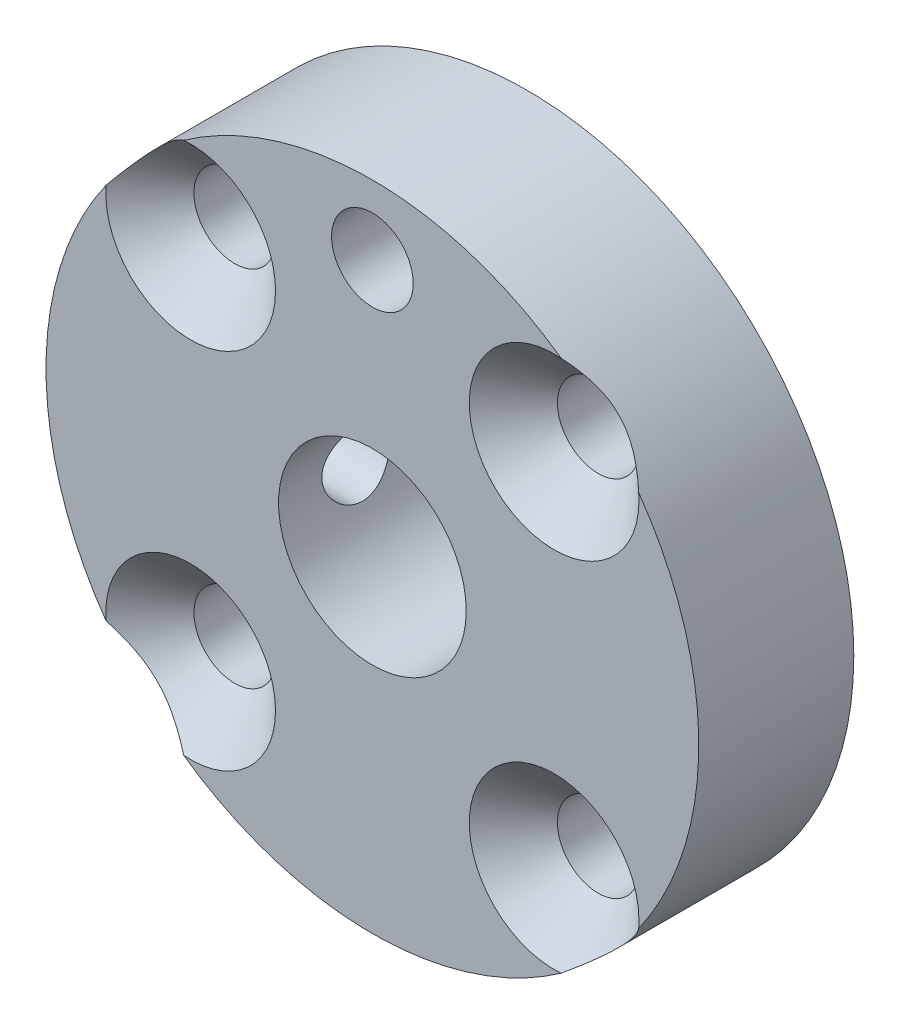
ISO-10303-21;
HEADER;
FILE_DESCRIPTION(('STEP AP214'),'2;1');
FILE_NAME('part.step','',(''),(''),'','','');
FILE_SCHEMA(('AUTOMOTIVE_DESIGN { 1 0 10303 214 1 1 1 1 }'));
ENDSEC;
DATA;
#1=APPLICATION_CONTEXT('core data for automotive mechanical design processes');
#2=APPLICATION_PROTOCOL_DEFINITION('international standard','automotive_design',2000,#1);
#3=PRODUCT_CONTEXT('',#1,'mechanical');
#4=PRODUCT('Part','Part','',(#3));
#5=PRODUCT_RELATED_PRODUCT_CATEGORY('part','',(#4));
#6=PRODUCT_DEFINITION_FORMATION('','',#4);
#7=PRODUCT_DEFINITION_CONTEXT('part definition',#1,'design');
#8=PRODUCT_DEFINITION('design','',#6,#7);
#9=PRODUCT_DEFINITION_SHAPE('','',#8);
#10=(LENGTH_UNIT() NAMED_UNIT(*) SI_UNIT(.MILLI.,.METRE.));
#11=(NAMED_UNIT(*) PLANE_ANGLE_UNIT() SI_UNIT($,.RADIAN.));
#12=(NAMED_UNIT(*) SI_UNIT($,.STERADIAN.) SOLID_ANGLE_UNIT());
#13=UNCERTAINTY_MEASURE_WITH_UNIT(LENGTH_MEASURE(1.E-05),#10,'distance_accuracy_value','');
#14=(GEOMETRIC_REPRESENTATION_CONTEXT(3) GLOBAL_UNCERTAINTY_ASSIGNED_CONTEXT((#13)) GLOBAL_UNIT_ASSIGNED_CONTEXT((#10,
#11,#12)) REPRESENTATION_CONTEXT('',''));
#15=CARTESIAN_POINT('',(0.,0.,0.));
#16=DIRECTION('',(0.,0.,1.));
#17=DIRECTION('',(1.,0.,0.));
#18=AXIS2_PLACEMENT_3D('',#15,#16,#17);
#19=CARTESIAN_POINT('',(0.,0.,9.5));
#20=DIRECTION('',(0.,0.,-1.));
#21=DIRECTION('',(-1.,0.,0.));
#22=AXIS2_PLACEMENT_3D('',#19,#20,#21);
#23=CYLINDRICAL_SURFACE('',#22,20.);
#24=CARTESIAN_POINT('',(-20.,0.,2.65));
#25=CARTESIAN_POINT('',(-19.9999985861225,0.117610574556953,2.65000507693582));
#26=CARTESIAN_POINT('',(-19.9989515701418,0.235298131378431,2.65991345047437));
#27=CARTESIAN_POINT('',(-19.9948755007952,0.467408281963046,2.6992890726702));
#28=CARTESIAN_POINT('',(-19.9918442846137,0.581827170618682,2.72877766463996));
#29=CARTESIAN_POINT('',(-19.9841418596598,0.804005356961037,2.80644387783767));
#30=CARTESIAN_POINT('',(-19.9794716623513,0.91176871384917,2.85460997454258));
#31=CARTESIAN_POINT('',(-19.9690129744413,1.11765859904565,2.96824102370233));
#32=CARTESIAN_POINT('',(-19.963224700667,1.2157869902952,3.03370262296467));
#33=CARTESIAN_POINT('',(-19.9511523144024,1.40003175469819,3.18034356452799));
#34=CARTESIAN_POINT('',(-19.944866531453,1.48610471828674,3.26157731577951));
#35=CARTESIAN_POINT('',(-19.9325213225088,1.64342207671848,3.43734038635586));
#36=CARTESIAN_POINT('',(-19.9264619071801,1.71466577354684,3.53187033118285));
#37=CARTESIAN_POINT('',(-19.915238578931,1.84045763756347,3.73181627291207));
#38=CARTESIAN_POINT('',(-19.9100768004705,1.89496624010398,3.83725729118829));
#39=CARTESIAN_POINT('',(-19.9012541874175,1.98548798456523,4.05585907572005));
#40=CARTESIAN_POINT('',(-19.8975933121633,2.02150162754854,4.16901963274495));
#41=CARTESIAN_POINT('',(-19.8922022962288,2.07388179744854,4.39940385685561));
#42=CARTESIAN_POINT('',(-19.890465054272,2.09032060381389,4.51661092150447));
#43=CARTESIAN_POINT('',(-19.889096025595,2.10330793490494,4.75213233959791));
#44=CARTESIAN_POINT('',(-19.8894641782095,2.09985703273741,4.87044666103966));
#45=CARTESIAN_POINT('',(-19.8922578534938,2.07322243378021,5.10432484493137));
#46=CARTESIAN_POINT('',(-19.8946751346228,2.05011778256067,5.21989782158943));
#47=CARTESIAN_POINT('',(-19.9012818323377,1.98495459652899,5.44551665211768));
#48=CARTESIAN_POINT('',(-19.9054712750661,1.94289578210746,5.55556242442464));
#49=CARTESIAN_POINT('',(-19.9151597133922,1.84093133329277,5.76725199714003));
#50=CARTESIAN_POINT('',(-19.9206612683861,1.78099076082822,5.86887884703867));
#51=CARTESIAN_POINT('',(-19.9323519192806,1.64498937257378,6.06066022974029));
#52=CARTESIAN_POINT('',(-19.9385410373735,1.56892803638548,6.15081439204018));
#53=CARTESIAN_POINT('',(-19.9509461711086,1.40240335664829,6.31755049018441));
#54=CARTESIAN_POINT('',(-19.9571621711797,1.31187177127052,6.39406428842377));
#55=CARTESIAN_POINT('',(-19.968892312137,1.11921304858704,6.53081915465265));
#56=CARTESIAN_POINT('',(-19.9744064521086,1.01708589617182,6.59106020143777));
#57=CARTESIAN_POINT('',(-19.9841136624366,0.804086871738417,6.69355731552919));
#58=CARTESIAN_POINT('',(-19.9883064679749,0.693213252337618,6.73580977820801));
#59=CARTESIAN_POINT('',(-19.9948959572163,0.465891500761026,6.80107963957572));
#60=CARTESIAN_POINT('',(-19.9972927001549,0.349443552565791,6.82409767263425));
#61=CARTESIAN_POINT('',(-20.0000123913183,0.114868577013525,6.85015849542004));
#62=CARTESIAN_POINT('',(-20.0003450977805,-0.00324789921030584,6.85329528014094));
#63=CARTESIAN_POINT('',(-19.9989254280681,-0.238324864201356,6.83975165496337));
#64=CARTESIAN_POINT('',(-19.997173083004,-0.355285370190176,6.82307154074638));
#65=CARTESIAN_POINT('',(-19.9917864257121,-0.584457914380877,6.77044560568869));
#66=CARTESIAN_POINT('',(-19.9881564277171,-0.696680202830055,6.7345439430821));
#67=CARTESIAN_POINT('',(-19.9794215373593,-0.913509726654129,6.64453950420683));
#68=CARTESIAN_POINT('',(-19.9743166087398,-1.01811677475236,6.59043628050276));
#69=CARTESIAN_POINT('',(-19.9631781959612,-1.21717044721087,6.46533244410499));
#70=CARTESIAN_POINT('',(-19.9571413566862,-1.31157817667962,6.39427024903457));
#71=CARTESIAN_POINT('',(-19.9448268762315,-1.48715924360521,6.23735374696773));
#72=CARTESIAN_POINT('',(-19.9385492283796,-1.56833221403401,6.15149902987892));
#73=CARTESIAN_POINT('',(-19.9264311606195,-1.71546723142883,5.96702372460093));
#74=CARTESIAN_POINT('',(-19.9205925796686,-1.78136747427046,5.86835370434373));
#75=CARTESIAN_POINT('',(-19.9100421218507,-1.8956611208723,5.6612917598991));
#76=CARTESIAN_POINT('',(-19.9053302282213,-1.94405478509178,5.55289998037995));
#77=CARTESIAN_POINT('',(-19.8975783355781,-2.02185870687172,5.32968102185269));
#78=CARTESIAN_POINT('',(-19.8945351306546,-2.0513053846878,5.21486665325648));
#79=CARTESIAN_POINT('',(-19.8904553699829,-2.09049747040514,4.98188948027015));
#80=CARTESIAN_POINT('',(-19.8894187502379,-2.10024350662607,4.86372678279138));
#81=CARTESIAN_POINT('',(-19.8894709750246,-2.09974842606066,4.62802153136607));
#82=CARTESIAN_POINT('',(-19.8905494954156,-2.08960439407621,4.51047875920022));
#83=CARTESIAN_POINT('',(-19.8946884320046,-2.04982105883557,4.27877732082041));
#84=CARTESIAN_POINT('',(-19.8977488501174,-2.02018173674434,4.16461865787607));
#85=CARTESIAN_POINT('',(-19.9055038265572,-1.94227663661315,3.94292895888757));
#86=CARTESIAN_POINT('',(-19.9101981047892,-1.8940140510329,3.83539679057034));
#87=CARTESIAN_POINT('',(-19.9206924240923,-1.78024229516215,3.62994345840374));
#88=CARTESIAN_POINT('',(-19.9264924626736,-1.71473316370626,3.53202227291369));
#89=CARTESIAN_POINT('',(-19.9385787157003,-1.56796388588165,3.34807307478967));
#90=CARTESIAN_POINT('',(-19.9448670815623,-1.4866313492115,3.26210296030793));
#91=CARTESIAN_POINT('',(-19.9572018929493,-1.3106694114521,3.10498969119307));
#92=CARTESIAN_POINT('',(-19.9632482803496,-1.21603683994904,3.03385008187198));
#93=CARTESIAN_POINT('',(-19.9744353744075,-1.01587362585845,2.90826068353255));
#94=CARTESIAN_POINT('',(-19.9795735493958,-0.910313780947586,2.85385724440098));
#95=CARTESIAN_POINT('',(-19.9883382268768,-0.691568973167298,2.76362144939512));
#96=CARTESIAN_POINT('',(-19.9919664216767,-0.578392712609078,2.72776829230472));
#97=CARTESIAN_POINT('',(-19.9963973899638,-0.387154461046657,2.68452608702119));
#98=CARTESIAN_POINT('',(-19.9977420180587,-0.31031218759518,2.67159665943456));
#99=CARTESIAN_POINT('',(-19.9995437889269,-0.15565784850026,2.65433195575876));
#100=CARTESIAN_POINT('',(-20.0000009358377,-0.0778457873796143,2.64999663960432));
#101=CARTESIAN_POINT('',(-20.,0.,2.65));
#102=B_SPLINE_CURVE_WITH_KNOTS('',3,(#24,#25,#26,#27,#28,#29,#30,#31,#32,#33,#34,#35,#36,#37,
#38,#39,#40,#41,#42,#43,#44,#45,#46,#47,#48,#49,#50,#51,#52,#53,#54,#55,#56,#57,#58,#59,#60,#61,
#62,#63,#64,#65,#66,#67,#68,#69,#70,#71,#72,#73,#74,#75,#76,#77,#78,#79,#80,#81,#82,#83,#84,#85,
#86,#87,#88,#89,#90,#91,#92,#93,#94,#95,#96,#97,#98,#99,#100,#101),.UNSPECIFIED.,.T.,.F.,(4,2,2,
2,2,2,2,2,2,2,2,2,2,2,2,2,2,2,2,2,2,2,2,2,2,2,2,2,2,2,2,2,2,2,2,2,2,2,4),(0.,0.352547445376477,
0.705479815473271,1.05819476242917,1.41084137634127,1.76472684686617,2.11862897104477,
2.47336144998343,2.82808431805778,3.18149328120567,3.53489206119519,3.8868761877292,
4.2388655068582,4.59154711145464,4.94424010278875,5.29864833369556,5.65305702641607,
6.00753670363999,6.36200468932826,6.71479555573139,7.06758115832308,7.41955975201312,
7.7715469987624,8.1248323890423,8.47812757501263,8.8328284043015,9.18752395620733,
9.54153565252774,9.89553605804705,10.2478128639807,10.6000900102609,10.9523067948682,
11.3045227863845,11.6583897165679,12.0123411437847,12.3672641737055,12.7217883461217,
12.9551386339019,13.1884878338135),.UNSPECIFIED.);
#103=CARTESIAN_POINT('',(-20.,0.,2.65));
#104=VERTEX_POINT('',#103);
#105=EDGE_CURVE('E170',#104,#104,#102,.T.);
#106=ORIENTED_EDGE('',*,*,#105,.T.);
#107=EDGE_LOOP('',(#106));
#108=FACE_BOUND('',#107,.T.);
#109=CARTESIAN_POINT('',(0.,0.,9.5));
#110=DIRECTION('',(0.,0.,1.));
#111=DIRECTION('',(1.,0.,0.));
#112=AXIS2_PLACEMENT_3D('',#109,#110,#111);
#113=CIRCLE('',#112,20.);
#114=CARTESIAN_POINT('',(-16.3195569118076,11.5616634703779,9.5));
#115=VERTEX_POINT('',#114);
#116=CARTESIAN_POINT('',(-16.3195569118058,-11.5616634703805,9.5));
#117=VERTEX_POINT('',#116);
#118=EDGE_CURVE('E83',#115,#117,#113,.T.);
#119=ORIENTED_EDGE('',*,*,#118,.F.);
#120=CARTESIAN_POINT('',(-16.3197838203023,11.5613431770967,9.5002));
#121=CARTESIAN_POINT('',(-16.266047989048,11.6371941920835,9.45284022649749));
#122=CARTESIAN_POINT('',(-16.2114871973565,11.7130916537688,9.40649444186745));
#123=CARTESIAN_POINT('',(-16.1006184867016,11.8650301176724,9.31612346753996));
#124=CARTESIAN_POINT('',(-16.0443100838378,11.9410711540717,9.27209892985143));
#125=CARTESIAN_POINT('',(-15.8722437480875,12.1699801398153,9.14367221516793));
#126=CARTESIAN_POINT('',(-15.7537375631782,12.3230780707886,9.06326885314176));
#127=CARTESIAN_POINT('',(-15.5080388395575,12.6309063443493,8.91573015291581));
#128=CARTESIAN_POINT('',(-15.3807884946786,12.7856403816269,8.84869743549421));
#129=CARTESIAN_POINT('',(-15.1183667833036,13.0948837172638,8.73258435348682));
#130=CARTESIAN_POINT('',(-14.983207808793,13.2493929980054,8.6834767322335));
#131=CARTESIAN_POINT('',(-14.7411515178535,13.5174763232225,8.61676777734356));
#132=CARTESIAN_POINT('',(-14.6359293630121,13.631354992617,8.59431112552484));
#133=CARTESIAN_POINT('',(-14.4218912920619,13.8576074973924,8.56251828622671));
#134=CARTESIAN_POINT('',(-14.3130752559651,13.9699812823537,8.55318253726517));
#135=CARTESIAN_POINT('',(-14.0932806041247,14.1916761183303,8.54820418388637));
#136=CARTESIAN_POINT('',(-13.9823172867101,14.3010106206925,8.55248609516435));
#137=CARTESIAN_POINT('',(-13.7585565240296,14.5164132790773,8.57431763545091));
#138=CARTESIAN_POINT('',(-13.645758938468,14.6224811834384,8.59186828404687));
#139=CARTESIAN_POINT('',(-13.3884130161438,14.8589584216202,8.64572376448467));
#140=CARTESIAN_POINT('',(-13.2435534155625,14.9881641490615,8.68582493799161));
#141=CARTESIAN_POINT('',(-12.9534468201953,15.2395909564839,8.78296251378189));
#142=CARTESIAN_POINT('',(-12.8081996514266,15.3618080057497,8.84000857384715));
#143=CARTESIAN_POINT('',(-12.5174334034416,15.5996569314232,8.9680158046843));
#144=CARTESIAN_POINT('',(-12.3719156584845,15.7152596924195,9.039033177861));
#145=CARTESIAN_POINT('',(-12.0814448735207,15.9396476474728,9.19186441058441));
#146=CARTESIAN_POINT('',(-11.9364916550877,16.0484351932391,9.2736745153065));
#147=CARTESIAN_POINT('',(-11.7532951289558,16.1821606235906,9.38256791645128));
#148=CARTESIAN_POINT('',(-11.7148192458659,16.2100355872143,9.40574618673759));
#149=CARTESIAN_POINT('',(-11.6380063079743,16.265271011369,9.45259666089812));
#150=CARTESIAN_POINT('',(-11.599669170669,16.2926327146203,9.47626726386097));
#151=CARTESIAN_POINT('',(-11.5613431770966,16.3197838203023,9.5002));
#152=B_SPLINE_CURVE_WITH_KNOTS('',3,(#120,#121,#122,#123,#124,#125,#126,#127,#128,#129,#130,
#131,#132,#133,#134,#135,#136,#137,#138,#139,#140,#141,#142,#143,#144,#145,#146,#147,#148,#149,
#150,#151),.UNSPECIFIED.,.F.,.F.,(4,2,2,2,2,2,2,2,2,2,2,2,2,2,2,4),(0.,0.312961321721647,
0.626010087070757,1.2544030399233,1.88744760069102,2.51952551215597,2.9889863502771,
3.45846287802519,3.92534158689123,4.39225617498378,4.98585097550969,5.57978474822161,
6.17615848126921,6.7723252785307,6.93091642056421,7.08905432803645),.UNSPECIFIED.);
#153=CARTESIAN_POINT('',(-11.5616634703805,16.3195569118058,9.5));
#154=VERTEX_POINT('',#153);
#155=EDGE_CURVE('E11',#115,#154,#152,.T.);
#156=ORIENTED_EDGE('',*,*,#155,.T.);
#157=CARTESIAN_POINT('',(11.5616634703779,16.3195569118076,9.5));
#158=VERTEX_POINT('',#157);
#159=EDGE_CURVE('E85',#158,#154,#113,.T.);
#160=ORIENTED_EDGE('',*,*,#159,.F.);
#161=CARTESIAN_POINT('',(11.5613431770967,16.3197838203023,9.5002));
#162=CARTESIAN_POINT('',(11.6371941920835,16.266047989048,9.45284022649749));
#163=CARTESIAN_POINT('',(11.7130916537688,16.2114871973565,9.40649444186745));
#164=CARTESIAN_POINT('',(11.8650301176724,16.1006184867016,9.31612346753996));
#165=CARTESIAN_POINT('',(11.9410711540717,16.0443100838378,9.27209892985143));
#166=CARTESIAN_POINT('',(12.1699801398153,15.8722437480875,9.14367221516793));
#167=CARTESIAN_POINT('',(12.3230780707886,15.7537375631782,9.06326885314176));
#168=CARTESIAN_POINT('',(12.6309063443492,15.5080388395575,8.91573015291581));
#169=CARTESIAN_POINT('',(12.7856403816269,15.3807884946786,8.84869743549421));
#170=CARTESIAN_POINT('',(13.0948837172638,15.1183667833036,8.73258435348682));
#171=CARTESIAN_POINT('',(13.2493929980054,14.983207808793,8.6834767322335));
#172=CARTESIAN_POINT('',(13.5174763232225,14.7411515178535,8.61676777734356));
#173=CARTESIAN_POINT('',(13.631354992617,14.6359293630121,8.59431112552484));
#174=CARTESIAN_POINT('',(13.8576074973924,14.4218912920619,8.56251828622671));
#175=CARTESIAN_POINT('',(13.9699812823537,14.3130752559651,8.55318253726517));
#176=CARTESIAN_POINT('',(14.1916761183303,14.0932806041247,8.54820418388637));
#177=CARTESIAN_POINT('',(14.3010106206925,13.9823172867101,8.55248609516435));
#178=CARTESIAN_POINT('',(14.5164132790773,13.7585565240296,8.57431763545091));
#179=CARTESIAN_POINT('',(14.6224811834384,13.645758938468,8.59186828404687));
#180=CARTESIAN_POINT('',(14.8589584216202,13.3884130161438,8.64572376448466));
#181=CARTESIAN_POINT('',(14.9881641490615,13.2435534155625,8.68582493799161));
#182=CARTESIAN_POINT('',(15.2395909564839,12.9534468201953,8.78296251378189));
#183=CARTESIAN_POINT('',(15.3618080057497,12.8081996514266,8.84000857384715));
#184=CARTESIAN_POINT('',(15.5996569314232,12.5174334034416,8.9680158046843));
#185=CARTESIAN_POINT('',(15.7152596924196,12.3719156584844,9.039033177861));
#186=CARTESIAN_POINT('',(15.9396476474728,12.0814448735207,9.1918644105844));
#187=CARTESIAN_POINT('',(16.0484351932391,11.9364916550877,9.2736745153065));
#188=CARTESIAN_POINT('',(16.1821606235906,11.7532951289558,9.38256791645128));
#189=CARTESIAN_POINT('',(16.2100355872143,11.7148192458658,9.40574618673759));
#190=CARTESIAN_POINT('',(16.265271011369,11.6380063079743,9.45259666089812));
#191=CARTESIAN_POINT('',(16.2926327146203,11.599669170669,9.47626726386097));
#192=CARTESIAN_POINT('',(16.3197838203023,11.5613431770966,9.5002));
#193=B_SPLINE_CURVE_WITH_KNOTS('',3,(#161,#162,#163,#164,#165,#166,#167,#168,#169,#170,#171,
#172,#173,#174,#175,#176,#177,#178,#179,#180,#181,#182,#183,#184,#185,#186,#187,#188,#189,#190,
#191,#192),.UNSPECIFIED.,.F.,.F.,(4,2,2,2,2,2,2,2,2,2,2,2,2,2,2,4),(0.,0.312961321721649,
0.626010087070761,1.2544030399233,1.88744760069102,2.51952551215597,2.9889863502771,
3.4584628780252,3.92534158689124,4.39225617498379,4.98585097550969,5.57978474822161,
6.17615848126922,6.77232527853071,6.93091642056421,7.08905432803646),.UNSPECIFIED.);
#194=CARTESIAN_POINT('',(16.3195569118058,11.5616634703805,9.5));
#195=VERTEX_POINT('',#194);
#196=EDGE_CURVE('E46',#158,#195,#193,.T.);
#197=ORIENTED_EDGE('',*,*,#196,.T.);
#198=CARTESIAN_POINT('',(16.3195569118076,-11.5616634703779,9.5));
#199=VERTEX_POINT('',#198);
#200=EDGE_CURVE('E96',#199,#195,#113,.T.);
#201=ORIENTED_EDGE('',*,*,#200,.F.);
#202=CARTESIAN_POINT('',(16.3197838203023,-11.5613431770967,9.5002));
#203=CARTESIAN_POINT('',(16.266047989048,-11.6371941920835,9.45284022649749));
#204=CARTESIAN_POINT('',(16.2114871973565,-11.7130916537688,9.40649444186745));
#205=CARTESIAN_POINT('',(16.1006184867016,-11.8650301176724,9.31612346753996));
#206=CARTESIAN_POINT('',(16.0443100838378,-11.9410711540717,9.27209892985143));
#207=CARTESIAN_POINT('',(15.8722437480875,-12.1699801398153,9.14367221516794));
#208=CARTESIAN_POINT('',(15.7537375631782,-12.3230780707886,9.06326885314176));
#209=CARTESIAN_POINT('',(15.5080388395575,-12.6309063443492,8.91573015291581));
#210=CARTESIAN_POINT('',(15.3807884946786,-12.7856403816269,8.84869743549421));
#211=CARTESIAN_POINT('',(15.1183667833036,-13.0948837172638,8.73258435348682));
#212=CARTESIAN_POINT('',(14.983207808793,-13.2493929980054,8.6834767322335));
#213=CARTESIAN_POINT('',(14.7411515178535,-13.5174763232225,8.61676777734356));
#214=CARTESIAN_POINT('',(14.6359293630121,-13.631354992617,8.59431112552484));
#215=CARTESIAN_POINT('',(14.4218912920619,-13.8576074973924,8.56251828622671));
#216=CARTESIAN_POINT('',(14.3130752559651,-13.9699812823537,8.55318253726517));
#217=CARTESIAN_POINT('',(14.0932806041247,-14.1916761183303,8.54820418388637));
#218=CARTESIAN_POINT('',(13.9823172867101,-14.3010106206925,8.55248609516435));
#219=CARTESIAN_POINT('',(13.7585565240296,-14.5164132790773,8.57431763545091));
#220=CARTESIAN_POINT('',(13.645758938468,-14.6224811834384,8.59186828404687));
#221=CARTESIAN_POINT('',(13.3884130161438,-14.8589584216202,8.64572376448467));
#222=CARTESIAN_POINT('',(13.2435534155625,-14.9881641490615,8.68582493799161));
#223=CARTESIAN_POINT('',(12.9534468201953,-15.2395909564839,8.78296251378189));
#224=CARTESIAN_POINT('',(12.8081996514266,-15.3618080057497,8.84000857384715));
#225=CARTESIAN_POINT('',(12.5174334034416,-15.5996569314232,8.9680158046843));
#226=CARTESIAN_POINT('',(12.3719156584845,-15.7152596924195,9.039033177861));
#227=CARTESIAN_POINT('',(12.0814448735207,-15.9396476474728,9.19186441058441));
#228=CARTESIAN_POINT('',(11.9364916550877,-16.0484351932391,9.2736745153065));
#229=CARTESIAN_POINT('',(11.7532951289558,-16.1821606235906,9.38256791645128));
#230=CARTESIAN_POINT('',(11.7148192458659,-16.2100355872143,9.40574618673759));
#231=CARTESIAN_POINT('',(11.6380063079743,-16.265271011369,9.45259666089812));
#232=CARTESIAN_POINT('',(11.599669170669,-16.2926327146203,9.47626726386097));
#233=CARTESIAN_POINT('',(11.5613431770966,-16.3197838203023,9.5002));
#234=B_SPLINE_CURVE_WITH_KNOTS('',3,(#202,#203,#204,#205,#206,#207,#208,#209,#210,#211,#212,
#213,#214,#215,#216,#217,#218,#219,#220,#221,#222,#223,#224,#225,#226,#227,#228,#229,#230,#231,
#232,#233),.UNSPECIFIED.,.F.,.F.,(4,2,2,2,2,2,2,2,2,2,2,2,2,2,2,4),(0.,0.312961321721647,
0.626010087070757,1.25440303992329,1.88744760069101,2.51952551215596,2.9889863502771,
3.45846287802519,3.92534158689122,4.39225617498378,4.98585097550968,5.5797847482216,
6.1761584812692,6.77232527853069,6.9309164205642,7.08905432803645),.UNSPECIFIED.);
#235=CARTESIAN_POINT('',(11.5616634703805,-16.3195569118058,9.5));
#236=VERTEX_POINT('',#235);
#237=EDGE_CURVE('E103',#199,#236,#234,.T.);
#238=ORIENTED_EDGE('',*,*,#237,.T.);
#239=CARTESIAN_POINT('',(-11.5616634703779,-16.3195569118076,9.5));
#240=VERTEX_POINT('',#239);
#241=EDGE_CURVE('E95',#240,#236,#113,.T.);
#242=ORIENTED_EDGE('',*,*,#241,.F.);
#243=CARTESIAN_POINT('',(-11.5613431770967,-16.3197838203023,9.5002));
#244=CARTESIAN_POINT('',(-11.6371941920835,-16.266047989048,9.45284022649749));
#245=CARTESIAN_POINT('',(-11.7130916537688,-16.2114871973565,9.40649444186745));
#246=CARTESIAN_POINT('',(-11.8650301176724,-16.1006184867016,9.31612346753996));
#247=CARTESIAN_POINT('',(-11.9410711540717,-16.0443100838378,9.27209892985143));
#248=CARTESIAN_POINT('',(-12.1699801398153,-15.8722437480875,9.14367221516793));
#249=CARTESIAN_POINT('',(-12.3230780707886,-15.7537375631782,9.06326885314176));
#250=CARTESIAN_POINT('',(-12.6309063443493,-15.5080388395575,8.91573015291581));
#251=CARTESIAN_POINT('',(-12.7856403816269,-15.3807884946786,8.84869743549421));
#252=CARTESIAN_POINT('',(-13.0948837172638,-15.1183667833036,8.73258435348682));
#253=CARTESIAN_POINT('',(-13.2493929980054,-14.983207808793,8.6834767322335));
#254=CARTESIAN_POINT('',(-13.5174763232225,-14.7411515178535,8.61676777734356));
#255=CARTESIAN_POINT('',(-13.631354992617,-14.6359293630121,8.59431112552484));
#256=CARTESIAN_POINT('',(-13.8576074973924,-14.4218912920619,8.56251828622671));
#257=CARTESIAN_POINT('',(-13.9699812823537,-14.3130752559651,8.55318253726517));
#258=CARTESIAN_POINT('',(-14.1916761183303,-14.0932806041247,8.54820418388637));
#259=CARTESIAN_POINT('',(-14.3010106206925,-13.9823172867101,8.55248609516435));
#260=CARTESIAN_POINT('',(-14.5164132790773,-13.7585565240296,8.57431763545091));
#261=CARTESIAN_POINT('',(-14.6224811834384,-13.645758938468,8.59186828404687));
#262=CARTESIAN_POINT('',(-14.8589584216202,-13.3884130161438,8.64572376448467));
#263=CARTESIAN_POINT('',(-14.9881641490615,-13.2435534155625,8.68582493799161));
#264=CARTESIAN_POINT('',(-15.2395909564839,-12.9534468201953,8.78296251378189));
#265=CARTESIAN_POINT('',(-15.3618080057497,-12.8081996514266,8.84000857384715));
#266=CARTESIAN_POINT('',(-15.5996569314232,-12.5174334034416,8.9680158046843));
#267=CARTESIAN_POINT('',(-15.7152596924195,-12.3719156584845,9.039033177861));
#268=CARTESIAN_POINT('',(-15.9396476474728,-12.0814448735207,9.19186441058441));
#269=CARTESIAN_POINT('',(-16.0484351932391,-11.9364916550877,9.2736745153065));
#270=CARTESIAN_POINT('',(-16.1821606235906,-11.7532951289558,9.38256791645128));
#271=CARTESIAN_POINT('',(-16.2100355872143,-11.7148192458659,9.40574618673759));
#272=CARTESIAN_POINT('',(-16.265271011369,-11.6380063079743,9.45259666089812));
#273=CARTESIAN_POINT('',(-16.2926327146203,-11.599669170669,9.47626726386097));
#274=CARTESIAN_POINT('',(-16.3197838203023,-11.5613431770966,9.5002));
#275=B_SPLINE_CURVE_WITH_KNOTS('',3,(#243,#244,#245,#246,#247,#248,#249,#250,#251,#252,#253,
#254,#255,#256,#257,#258,#259,#260,#261,#262,#263,#264,#265,#266,#267,#268,#269,#270,#271,#272,
#273,#274),.UNSPECIFIED.,.F.,.F.,(4,2,2,2,2,2,2,2,2,2,2,2,2,2,2,4),(0.,0.312961321721644,
0.626010087070756,1.25440303992329,1.88744760069101,2.51952551215596,2.9889863502771,
3.45846287802519,3.92534158689123,4.39225617498378,4.98585097550968,5.5797847482216,
6.1761584812692,6.7723252785307,6.9309164205642,7.08905432803645),.UNSPECIFIED.);
#276=EDGE_CURVE('E92',#240,#117,#275,.T.);
#277=ORIENTED_EDGE('',*,*,#276,.T.);
#278=EDGE_LOOP('',(#119,#156,#160,#197,#201,#238,#242,#277));
#279=FACE_BOUND('',#278,.T.);
#280=CARTESIAN_POINT('',(0.,0.,0.));
#281=DIRECTION('',(0.,0.,1.));
#282=DIRECTION('',(1.,0.,0.));
#283=AXIS2_PLACEMENT_3D('',#280,#281,#282);
#284=CIRCLE('',#283,20.);
#285=CARTESIAN_POINT('',(20.,0.,0.));
#286=VERTEX_POINT('',#285);
#287=EDGE_CURVE('E93',#286,#286,#284,.T.);
#288=ORIENTED_EDGE('',*,*,#287,.T.);
#289=EDGE_LOOP('',(#288));
#290=FACE_BOUND('',#289,.T.);
#291=ADVANCED_FACE('F33',(#108,#279,#290),#23,.T.);
#292=CARTESIAN_POINT('',(0.,0.,9.5));
#293=DIRECTION('',(0.,0.,1.));
#294=DIRECTION('',(1.,0.,0.));
#295=AXIS2_PLACEMENT_3D('',#292,#293,#294);
#296=PLANE('',#295);
#297=CARTESIAN_POINT('',(0.,0.,9.5));
#298=DIRECTION('',(0.,0.,1.));
#299=DIRECTION('',(1.,0.,0.));
#300=AXIS2_PLACEMENT_3D('',#297,#298,#299);
#301=CIRCLE('',#300,5.75);
#302=CARTESIAN_POINT('',(5.75,0.,9.5));
#303=VERTEX_POINT('',#302);
#304=EDGE_CURVE('E172',#303,#303,#301,.T.);
#305=ORIENTED_EDGE('',*,*,#304,.F.);
#306=EDGE_LOOP('',(#305));
#307=FACE_BOUND('',#306,.T.);
#308=CARTESIAN_POINT('',(0.,15.75,9.5));
#309=DIRECTION('',(0.,0.,1.));
#310=DIRECTION('',(1.,0.,0.));
#311=AXIS2_PLACEMENT_3D('',#308,#309,#310);
#312=CIRCLE('',#311,2.5);
#313=CARTESIAN_POINT('',(2.5,15.75,9.5));
#314=VERTEX_POINT('',#313);
#315=EDGE_CURVE('E244',#314,#314,#312,.T.);
#316=ORIENTED_EDGE('',*,*,#315,.F.);
#317=EDGE_LOOP('',(#316));
#318=FACE_BOUND('',#317,.T.);
#319=CARTESIAN_POINT('',(-11.1369318036881,11.1369318036881,9.5));
#320=DIRECTION('',(0.,0.,1.));
#321=DIRECTION('',(1.,0.,0.));
#322=AXIS2_PLACEMENT_3D('',#319,#320,#321);
#323=CIRCLE('',#322,5.2);
#324=EDGE_CURVE('E52',#115,#154,#323,.T.);
#325=ORIENTED_EDGE('',*,*,#324,.F.);
#326=ORIENTED_EDGE('',*,*,#118,.T.);
#327=CARTESIAN_POINT('',(-11.1369318036881,-11.1369318036881,9.5));
#328=DIRECTION('',(0.,0.,1.));
#329=DIRECTION('',(1.,0.,0.));
#330=AXIS2_PLACEMENT_3D('',#327,#328,#329);
#331=CIRCLE('',#330,5.2);
#332=EDGE_CURVE('E223',#240,#117,#331,.T.);
#333=ORIENTED_EDGE('',*,*,#332,.F.);
#334=ORIENTED_EDGE('',*,*,#241,.T.);
#335=CARTESIAN_POINT('',(11.1369318036881,-11.1369318036881,9.5));
#336=DIRECTION('',(0.,0.,1.));
#337=DIRECTION('',(1.,0.,0.));
#338=AXIS2_PLACEMENT_3D('',#335,#336,#337);
#339=CIRCLE('',#338,5.2);
#340=EDGE_CURVE('E107',#199,#236,#339,.T.);
#341=ORIENTED_EDGE('',*,*,#340,.F.);
#342=ORIENTED_EDGE('',*,*,#200,.T.);
#343=CARTESIAN_POINT('',(11.1369318036881,11.1369318036881,9.5));
#344=DIRECTION('',(0.,0.,1.));
#345=DIRECTION('',(1.,0.,0.));
#346=AXIS2_PLACEMENT_3D('',#343,#344,#345);
#347=CIRCLE('',#346,5.2);
#348=EDGE_CURVE('E58',#158,#195,#347,.T.);
#349=ORIENTED_EDGE('',*,*,#348,.F.);
#350=ORIENTED_EDGE('',*,*,#159,.T.);
#351=EDGE_LOOP('',(#325,#326,#333,#334,#341,#342,#349,#350));
#352=FACE_BOUND('',#351,.T.);
#353=ADVANCED_FACE('F81',(#307,#318,#352),#296,.T.);
#354=CARTESIAN_POINT('',(0.,0.,0.));
#355=DIRECTION('',(0.,0.,1.));
#356=DIRECTION('',(1.,0.,0.));
#357=AXIS2_PLACEMENT_3D('',#354,#355,#356);
#358=PLANE('',#357);
#359=CARTESIAN_POINT('',(0.,0.,0.));
#360=DIRECTION('',(0.,0.,1.));
#361=DIRECTION('',(1.,0.,0.));
#362=AXIS2_PLACEMENT_3D('',#359,#360,#361);
#363=CIRCLE('',#362,5.75);
#364=CARTESIAN_POINT('',(5.75,0.,0.));
#365=VERTEX_POINT('',#364);
#366=EDGE_CURVE('E175',#365,#365,#363,.T.);
#367=ORIENTED_EDGE('',*,*,#366,.T.);
#368=EDGE_LOOP('',(#367));
#369=FACE_BOUND('',#368,.T.);
#370=CARTESIAN_POINT('',(0.,15.75,0.));
#371=DIRECTION('',(0.,0.,1.));
#372=DIRECTION('',(1.,0.,0.));
#373=AXIS2_PLACEMENT_3D('',#370,#371,#372);
#374=CIRCLE('',#373,2.5);
#375=CARTESIAN_POINT('',(2.5,15.75,0.));
#376=VERTEX_POINT('',#375);
#377=EDGE_CURVE('E87',#376,#376,#374,.T.);
#378=ORIENTED_EDGE('',*,*,#377,.T.);
#379=EDGE_LOOP('',(#378));
#380=FACE_BOUND('',#379,.T.);
#381=CARTESIAN_POINT('',(-11.1369318036881,11.1369318036881,0.));
#382=DIRECTION('',(0.,0.,1.));
#383=DIRECTION('',(1.,0.,0.));
#384=AXIS2_PLACEMENT_3D('',#381,#382,#383);
#385=CIRCLE('',#384,2.5);
#386=CARTESIAN_POINT('',(-8.63693180368811,11.1369318036881,0.));
#387=VERTEX_POINT('',#386);
#388=EDGE_CURVE('E203',#387,#387,#385,.T.);
#389=ORIENTED_EDGE('',*,*,#388,.T.);
#390=EDGE_LOOP('',(#389));
#391=FACE_BOUND('',#390,.T.);
#392=CARTESIAN_POINT('',(11.1369318036881,11.1369318036881,0.));
#393=DIRECTION('',(0.,0.,1.));
#394=DIRECTION('',(1.,0.,0.));
#395=AXIS2_PLACEMENT_3D('',#392,#393,#394);
#396=CIRCLE('',#395,2.5);
#397=CARTESIAN_POINT('',(13.6369318036881,11.1369318036881,0.));
#398=VERTEX_POINT('',#397);
#399=EDGE_CURVE('E213',#398,#398,#396,.T.);
#400=ORIENTED_EDGE('',*,*,#399,.T.);
#401=EDGE_LOOP('',(#400));
#402=FACE_BOUND('',#401,.T.);
#403=CARTESIAN_POINT('',(11.1369318036881,-11.1369318036881,0.));
#404=DIRECTION('',(0.,0.,1.));
#405=DIRECTION('',(1.,0.,0.));
#406=AXIS2_PLACEMENT_3D('',#403,#404,#405);
#407=CIRCLE('',#406,2.5);
#408=CARTESIAN_POINT('',(13.6369318036881,-11.1369318036881,0.));
#409=VERTEX_POINT('',#408);
#410=EDGE_CURVE('E220',#409,#409,#407,.T.);
#411=ORIENTED_EDGE('',*,*,#410,.T.);
#412=EDGE_LOOP('',(#411));
#413=FACE_BOUND('',#412,.T.);
#414=CARTESIAN_POINT('',(-11.1369318036881,-11.1369318036881,0.));
#415=DIRECTION('',(0.,0.,1.));
#416=DIRECTION('',(1.,0.,0.));
#417=AXIS2_PLACEMENT_3D('',#414,#415,#416);
#418=CIRCLE('',#417,2.5);
#419=CARTESIAN_POINT('',(-8.63693180368814,-11.1369318036881,0.));
#420=VERTEX_POINT('',#419);
#421=EDGE_CURVE('E98',#420,#420,#418,.T.);
#422=ORIENTED_EDGE('',*,*,#421,.T.);
#423=EDGE_LOOP('',(#422));
#424=FACE_BOUND('',#423,.T.);
#425=ORIENTED_EDGE('',*,*,#287,.F.);
#426=EDGE_LOOP('',(#425));
#427=FACE_BOUND('',#426,.T.);
#428=ADVANCED_FACE('F147',(#369,#380,#391,#402,#413,#424,#427),#358,.F.);
#429=CARTESIAN_POINT('',(-11.1369318036881,-11.1369318036881,9.5));
#430=DIRECTION('',(0.,0.,1.));
#431=DIRECTION('',(1.,0.,0.));
#432=AXIS2_PLACEMENT_3D('',#429,#430,#431);
#433=CONICAL_SURFACE('',#432,5.2,0.785398163397449);
#434=CARTESIAN_POINT('',(-11.1369318036881,-11.1369318036881,6.8));
#435=DIRECTION('',(0.,0.,1.));
#436=DIRECTION('',(1.,0.,0.));
#437=AXIS2_PLACEMENT_3D('',#434,#435,#436);
#438=CIRCLE('',#437,2.5);
#439=CARTESIAN_POINT('',(-8.63693180368814,-11.1369318036881,6.8));
#440=VERTEX_POINT('',#439);
#441=EDGE_CURVE('E225',#440,#440,#438,.T.);
#442=ORIENTED_EDGE('',*,*,#441,.F.);
#443=EDGE_LOOP('',(#442));
#444=FACE_BOUND('',#443,.T.);
#445=ORIENTED_EDGE('',*,*,#332,.T.);
#446=ORIENTED_EDGE('',*,*,#276,.F.);
#447=EDGE_LOOP('',(#445,#446));
#448=FACE_BOUND('',#447,.T.);
#449=ADVANCED_FACE('F143',(#444,#448),#433,.F.);
#450=CARTESIAN_POINT('',(-11.1369318036881,-11.1369318036881,9.5));
#451=DIRECTION('',(0.,0.,1.));
#452=DIRECTION('',(1.,0.,0.));
#453=AXIS2_PLACEMENT_3D('',#450,#451,#452);
#454=CYLINDRICAL_SURFACE('',#453,2.5);
#455=ORIENTED_EDGE('',*,*,#421,.F.);
#456=EDGE_LOOP('',(#455));
#457=FACE_BOUND('',#456,.T.);
#458=ORIENTED_EDGE('',*,*,#441,.T.);
#459=EDGE_LOOP('',(#458));
#460=FACE_BOUND('',#459,.T.);
#461=ADVANCED_FACE('F138',(#457,#460),#454,.F.);
#462=CARTESIAN_POINT('',(11.1369318036881,-11.1369318036881,9.5));
#463=DIRECTION('',(0.,0.,1.));
#464=DIRECTION('',(1.,0.,0.));
#465=AXIS2_PLACEMENT_3D('',#462,#463,#464);
#466=CONICAL_SURFACE('',#465,5.2,0.785398163397449);
#467=CARTESIAN_POINT('',(11.1369318036881,-11.1369318036881,6.8));
#468=DIRECTION('',(0.,0.,1.));
#469=DIRECTION('',(1.,0.,0.));
#470=AXIS2_PLACEMENT_3D('',#467,#468,#469);
#471=CIRCLE('',#470,2.5);
#472=CARTESIAN_POINT('',(13.6369318036881,-11.1369318036881,6.8));
#473=VERTEX_POINT('',#472);
#474=EDGE_CURVE('E217',#473,#473,#471,.T.);
#475=ORIENTED_EDGE('',*,*,#474,.F.);
#476=EDGE_LOOP('',(#475));
#477=FACE_BOUND('',#476,.T.);
#478=ORIENTED_EDGE('',*,*,#340,.T.);
#479=ORIENTED_EDGE('',*,*,#237,.F.);
#480=EDGE_LOOP('',(#478,#479));
#481=FACE_BOUND('',#480,.T.);
#482=ADVANCED_FACE('F134',(#477,#481),#466,.F.);
#483=CARTESIAN_POINT('',(11.1369318036881,-11.1369318036881,9.5));
#484=DIRECTION('',(0.,0.,1.));
#485=DIRECTION('',(1.,0.,0.));
#486=AXIS2_PLACEMENT_3D('',#483,#484,#485);
#487=CYLINDRICAL_SURFACE('',#486,2.5);
#488=ORIENTED_EDGE('',*,*,#410,.F.);
#489=EDGE_LOOP('',(#488));
#490=FACE_BOUND('',#489,.T.);
#491=ORIENTED_EDGE('',*,*,#474,.T.);
#492=EDGE_LOOP('',(#491));
#493=FACE_BOUND('',#492,.T.);
#494=ADVANCED_FACE('F129',(#490,#493),#487,.F.);
#495=CARTESIAN_POINT('',(11.1369318036881,11.1369318036881,9.5));
#496=DIRECTION('',(0.,0.,1.));
#497=DIRECTION('',(1.,0.,0.));
#498=AXIS2_PLACEMENT_3D('',#495,#496,#497);
#499=CONICAL_SURFACE('',#498,5.2,0.785398163397449);
#500=CARTESIAN_POINT('',(11.1369318036881,11.1369318036881,6.8));
#501=DIRECTION('',(0.,0.,1.));
#502=DIRECTION('',(1.,0.,0.));
#503=AXIS2_PLACEMENT_3D('',#500,#501,#502);
#504=CIRCLE('',#503,2.5);
#505=CARTESIAN_POINT('',(13.6369318036881,11.1369318036881,6.8));
#506=VERTEX_POINT('',#505);
#507=EDGE_CURVE('E210',#506,#506,#504,.T.);
#508=ORIENTED_EDGE('',*,*,#507,.F.);
#509=EDGE_LOOP('',(#508));
#510=FACE_BOUND('',#509,.T.);
#511=ORIENTED_EDGE('',*,*,#348,.T.);
#512=ORIENTED_EDGE('',*,*,#196,.F.);
#513=EDGE_LOOP('',(#511,#512));
#514=FACE_BOUND('',#513,.T.);
#515=ADVANCED_FACE('F123',(#510,#514),#499,.F.);
#516=CARTESIAN_POINT('',(11.1369318036881,11.1369318036881,9.5));
#517=DIRECTION('',(0.,0.,1.));
#518=DIRECTION('',(1.,0.,0.));
#519=AXIS2_PLACEMENT_3D('',#516,#517,#518);
#520=CYLINDRICAL_SURFACE('',#519,2.5);
#521=ORIENTED_EDGE('',*,*,#399,.F.);
#522=EDGE_LOOP('',(#521));
#523=FACE_BOUND('',#522,.T.);
#524=ORIENTED_EDGE('',*,*,#507,.T.);
#525=EDGE_LOOP('',(#524));
#526=FACE_BOUND('',#525,.T.);
#527=ADVANCED_FACE('F128',(#523,#526),#520,.F.);
#528=CARTESIAN_POINT('',(-11.1369318036881,11.1369318036881,9.5));
#529=DIRECTION('',(0.,0.,1.));
#530=DIRECTION('',(1.,0.,0.));
#531=AXIS2_PLACEMENT_3D('',#528,#529,#530);
#532=CONICAL_SURFACE('',#531,5.2,0.785398163397449);
#533=CARTESIAN_POINT('',(-11.1369318036881,11.1369318036881,6.8));
#534=DIRECTION('',(0.,0.,1.));
#535=DIRECTION('',(1.,0.,0.));
#536=AXIS2_PLACEMENT_3D('',#533,#534,#535);
#537=CIRCLE('',#536,2.5);
#538=CARTESIAN_POINT('',(-8.63693180368811,11.1369318036881,6.8));
#539=VERTEX_POINT('',#538);
#540=EDGE_CURVE('E86',#539,#539,#537,.T.);
#541=ORIENTED_EDGE('',*,*,#540,.F.);
#542=EDGE_LOOP('',(#541));
#543=FACE_BOUND('',#542,.T.);
#544=ORIENTED_EDGE('',*,*,#324,.T.);
#545=ORIENTED_EDGE('',*,*,#155,.F.);
#546=EDGE_LOOP('',(#544,#545));
#547=FACE_BOUND('',#546,.T.);
#548=ADVANCED_FACE('F75',(#543,#547),#532,.F.);
#549=CARTESIAN_POINT('',(-11.1369318036881,11.1369318036881,9.5));
#550=DIRECTION('',(0.,0.,1.));
#551=DIRECTION('',(1.,0.,0.));
#552=AXIS2_PLACEMENT_3D('',#549,#550,#551);
#553=CYLINDRICAL_SURFACE('',#552,2.5);
#554=ORIENTED_EDGE('',*,*,#388,.F.);
#555=EDGE_LOOP('',(#554));
#556=FACE_BOUND('',#555,.T.);
#557=ORIENTED_EDGE('',*,*,#540,.T.);
#558=EDGE_LOOP('',(#557));
#559=FACE_BOUND('',#558,.T.);
#560=ADVANCED_FACE('F131',(#556,#559),#553,.F.);
#561=CARTESIAN_POINT('',(0.,15.75,0.));
#562=DIRECTION('',(0.,0.,1.));
#563=DIRECTION('',(1.,0.,0.));
#564=AXIS2_PLACEMENT_3D('',#561,#562,#563);
#565=CYLINDRICAL_SURFACE('',#564,2.5);
#566=ORIENTED_EDGE('',*,*,#377,.F.);
#567=EDGE_LOOP('',(#566));
#568=FACE_BOUND('',#567,.T.);
#569=ORIENTED_EDGE('',*,*,#315,.T.);
#570=EDGE_LOOP('',(#569));
#571=FACE_BOUND('',#570,.T.);
#572=ADVANCED_FACE('F189',(#568,#571),#565,.F.);
#573=CARTESIAN_POINT('',(0.,0.,0.));
#574=DIRECTION('',(0.,0.,1.));
#575=DIRECTION('',(1.,0.,0.));
#576=AXIS2_PLACEMENT_3D('',#573,#574,#575);
#577=CYLINDRICAL_SURFACE('',#576,5.75);
#578=CARTESIAN_POINT('',(-5.75,0.,2.65));
#579=CARTESIAN_POINT('',(-5.75000227555985,-0.113937130860028,2.64999689922804));
#580=CARTESIAN_POINT('',(-5.74658356358635,-0.227852508844673,2.65930193346913));
#581=CARTESIAN_POINT('',(-5.73328601817462,-0.452290407567758,2.69613468617886));
#582=CARTESIAN_POINT('',(-5.7234077417906,-0.562813220010896,2.72366083331378));
#583=CARTESIAN_POINT('',(-5.6982546301168,-0.777197468839376,2.79584028201193));
#584=CARTESIAN_POINT('',(-5.68298987666045,-0.881070924590438,2.84046159994048));
#585=CARTESIAN_POINT('',(-5.64859324016113,-1.07985336639648,2.94540647873817));
#586=CARTESIAN_POINT('',(-5.62946037934645,-1.17476007693898,3.00573401090153));
#587=CARTESIAN_POINT('',(-5.5884439621595,-1.35676790709994,3.14294044918033));
#588=CARTESIAN_POINT('',(-5.5664853636947,-1.44345624982816,3.22034428953041));
#589=CARTESIAN_POINT('',(-5.52267188298321,-1.60295008658549,3.38839155159202));
#590=CARTESIAN_POINT('',(-5.50081703186174,-1.67575164303804,3.47903871559901));
#591=CARTESIAN_POINT('',(-5.45882427953749,-1.80796319890524,3.67495453807211));
#592=CARTESIAN_POINT('',(-5.43877566218414,-1.86680156952839,3.78062999029193));
#593=CARTESIAN_POINT('',(-5.40382651474749,-1.96568822625909,4.00122508698253));
#594=CARTESIAN_POINT('',(-5.38892404929294,-2.00574357834082,4.11614123611089));
#595=CARTESIAN_POINT('',(-5.36675382000761,-2.06431714791315,4.34721576510481));
#596=CARTESIAN_POINT('',(-5.359209013663,-2.08361995365577,4.46314781389974));
#597=CARTESIAN_POINT('',(-5.35179531172606,-2.10259388864396,4.69683207572532));
#598=CARTESIAN_POINT('',(-5.35192345205499,-2.10227259872643,4.81458356832617));
#599=CARTESIAN_POINT('',(-5.35960132749292,-2.08260961701066,5.04151057946025));
#600=CARTESIAN_POINT('',(-5.36673284138613,-2.06433973908822,5.15079570266217));
#601=CARTESIAN_POINT('',(-5.38692149098888,-2.01106435492776,5.36462611696199));
#602=CARTESIAN_POINT('',(-5.39997947269081,-1.97605645933036,5.46917072901635));
#603=CARTESIAN_POINT('',(-5.43081252832565,-1.88968342580015,5.67279739788527));
#604=CARTESIAN_POINT('',(-5.44866950532004,-1.83803084034486,5.77174458139199));
#605=CARTESIAN_POINT('',(-5.48705952742517,-1.72003471800454,5.95988475346292));
#606=CARTESIAN_POINT('',(-5.50759346113283,-1.653686297806,6.04907448494866));
#607=CARTESIAN_POINT('',(-5.55061486363297,-1.50321887569761,6.22112382777551));
#608=CARTESIAN_POINT('',(-5.5731435938289,-1.41823911645101,6.30322210792854));
#609=CARTESIAN_POINT('',(-5.61649075352765,-1.23545324886213,6.45222207536754));
#610=CARTESIAN_POINT('',(-5.6373089463026,-1.13764537003355,6.51912166150131));
#611=CARTESIAN_POINT('',(-5.67526612968456,-0.930118360689406,6.63660749737671));
#612=CARTESIAN_POINT('',(-5.69234956557631,-0.82025171721126,6.68695239522208));
#613=CARTESIAN_POINT('',(-5.72050279049752,-0.592830419455531,6.7681960074878));
#614=CARTESIAN_POINT('',(-5.73157510700357,-0.47527901969409,6.79910289581481));
#615=CARTESIAN_POINT('',(-5.74602047254672,-0.24224187112115,6.83915778358241));
#616=CARTESIAN_POINT('',(-5.74975622571288,-0.126954778046433,6.84933181400566));
#617=CARTESIAN_POINT('',(-5.75022031427014,0.103725836279751,6.85060394966178));
#618=CARTESIAN_POINT('',(-5.74695010923627,0.219119330358023,6.84170602821889));
#619=CARTESIAN_POINT('',(-5.73400931432052,0.442383706311511,6.80587523303501));
#620=CARTESIAN_POINT('',(-5.72457371263234,0.550375812160215,6.77960409533696));
#621=CARTESIAN_POINT('',(-5.70048615006724,0.760351900785136,6.71063309860092));
#622=CARTESIAN_POINT('',(-5.68583351059658,0.862335099954969,6.66793110229986));
#623=CARTESIAN_POINT('',(-5.65224456075179,1.06068186427378,6.56596979516173));
#624=CARTESIAN_POINT('',(-5.63319714023749,1.15679934940185,6.50626948723488));
#625=CARTESIAN_POINT('',(-5.5929395210362,1.33796630549198,6.3725090396181));
#626=CARTESIAN_POINT('',(-5.57172855547113,1.42301182746355,6.29844379977065));
#627=CARTESIAN_POINT('',(-5.5280401621957,1.58450460758437,6.13325923458628));
#628=CARTESIAN_POINT('',(-5.50555720591526,1.66022231014901,6.0414262854723));
#629=CARTESIAN_POINT('',(-5.46300427039495,1.79530357496391,5.84590294552077));
#630=CARTESIAN_POINT('',(-5.44293445079576,1.85466605557226,5.74221177108866));
#631=CARTESIAN_POINT('',(-5.40759801204232,1.95531365123406,5.52528778399535));
#632=CARTESIAN_POINT('',(-5.39234291048884,1.99655550972094,5.41203290075004));
#633=CARTESIAN_POINT('',(-5.36876289061437,2.0591320906421,5.17947894481193));
#634=CARTESIAN_POINT('',(-5.36043398307046,2.08047827308221,5.06018339337943));
#635=CARTESIAN_POINT('',(-5.35216132258662,2.10166267527631,4.82679331915929));
#636=CARTESIAN_POINT('',(-5.35173580827812,2.10273668080984,4.7128270338788));
#637=CARTESIAN_POINT('',(-5.35809360995963,2.08648208078674,4.4864302721427));
#638=CARTESIAN_POINT('',(-5.36487631254227,2.06915504112878,4.37399966582792));
#639=CARTESIAN_POINT('',(-5.38449502555307,2.01753277896432,4.15698446588489));
#640=CARTESIAN_POINT('',(-5.397159815355,1.98371623996645,4.05226922988225));
#641=CARTESIAN_POINT('',(-5.42702431508133,1.90048739932391,3.84993163001929));
#642=CARTESIAN_POINT('',(-5.44422514188197,1.85107125610794,3.75231102058016));
#643=CARTESIAN_POINT('',(-5.48230314282348,1.73515064529513,3.56158682595134));
#644=CARTESIAN_POINT('',(-5.50332194561516,1.66791024163996,3.46895911913644));
#645=CARTESIAN_POINT('',(-5.54615605658792,1.51941400840166,3.29590575995313));
#646=CARTESIAN_POINT('',(-5.56797160951574,1.43815384317423,3.21548389677547));
#647=CARTESIAN_POINT('',(-5.61125787858458,1.25903855032038,3.06501532143905));
#648=CARTESIAN_POINT('',(-5.63265618545841,1.16055472749863,2.99569299872581));
#649=CARTESIAN_POINT('',(-5.67152956034858,0.952590942982789,2.87462170148543));
#650=CARTESIAN_POINT('',(-5.68900466115754,0.84311107321161,2.82287258006864));
#651=CARTESIAN_POINT('',(-5.71834954125731,0.613692035977455,2.73787227382957));
#652=CARTESIAN_POINT('',(-5.73008999055137,0.493577934873629,2.70504512058474));
#653=CARTESIAN_POINT('',(-5.74591230205855,0.248965941143725,2.6611154285136));
#654=CARTESIAN_POINT('',(-5.74999751407719,0.124469990250958,2.65000338742123));
#655=CARTESIAN_POINT('',(-5.75,0.,2.65));
#656=B_SPLINE_CURVE_WITH_KNOTS('',3,(#578,#579,#580,#581,#582,#583,#584,#585,#586,#587,#588,
#589,#590,#591,#592,#593,#594,#595,#596,#597,#598,#599,#600,#601,#602,#603,#604,#605,#606,#607,
#608,#609,#610,#611,#612,#613,#614,#615,#616,#617,#618,#619,#620,#621,#622,#623,#624,#625,#626,
#627,#628,#629,#630,#631,#632,#633,#634,#635,#636,#637,#638,#639,#640,#641,#642,#643,#644,#645,
#646,#647,#648,#649,#650,#651,#652,#653,#654,#655),.UNSPECIFIED.,.T.,.F.,(4,2,2,2,2,2,2,2,2,2,2,
2,2,2,2,2,2,2,2,2,2,2,2,2,2,2,2,2,2,2,2,2,2,2,2,2,2,2,4),(0.,0.341352530914199,
0.682675628452048,1.02336323312065,1.36413706397435,1.71738227063722,2.07072749101812,
2.43670168095298,2.80253808457637,3.15399624310187,3.50531863332657,3.83686255264877,
4.1684538141483,4.50610953990744,4.84387763485911,5.20308890101177,5.56234979635499,
5.9266374376639,6.29077178922318,6.63639953008857,6.98195527215676,7.31505350304126,
7.64819507672125,7.99092085335356,8.33376853560048,8.69546115839776,9.0571776957618,
9.4197530731199,9.78211947600277,10.1223196156777,10.4624908071999,10.7933271295444,
11.1242449875523,11.4718468299498,11.8195563623536,12.1847376935917,12.5499159723025,
12.9229879504571,13.2958966403136),.UNSPECIFIED.);
#657=CARTESIAN_POINT('',(-5.75,0.,2.65));
#658=VERTEX_POINT('',#657);
#659=EDGE_CURVE('E37',#658,#658,#656,.T.);
#660=ORIENTED_EDGE('',*,*,#659,.T.);
#661=EDGE_LOOP('',(#660));
#662=FACE_BOUND('',#661,.T.);
#663=ORIENTED_EDGE('',*,*,#366,.F.);
#664=EDGE_LOOP('',(#663));
#665=FACE_BOUND('',#664,.T.);
#666=ORIENTED_EDGE('',*,*,#304,.T.);
#667=EDGE_LOOP('',(#666));
#668=FACE_BOUND('',#667,.T.);
#669=ADVANCED_FACE('F184',(#662,#665,#668),#577,.F.);
#670=CARTESIAN_POINT('',(-20.,0.,4.75));
#671=DIRECTION('',(1.,0.,0.));
#672=DIRECTION('',(0.,0.,-1.));
#673=AXIS2_PLACEMENT_3D('',#670,#671,#672);
#674=CYLINDRICAL_SURFACE('',#673,2.1);
#675=ORIENTED_EDGE('',*,*,#659,.F.);
#676=EDGE_LOOP('',(#675));
#677=FACE_BOUND('',#676,.T.);
#678=ORIENTED_EDGE('',*,*,#105,.F.);
#679=EDGE_LOOP('',(#678));
#680=FACE_BOUND('',#679,.T.);
#681=ADVANCED_FACE('F181',(#677,#680),#674,.F.);
#682=CLOSED_SHELL('',(#291,#353,#428,#449,#461,#482,#494,#515,#527,#548,#560,#572,#669,#681));
#683=MANIFOLD_SOLID_BREP('B2',#682);
#684=ADVANCED_BREP_SHAPE_REPRESENTATION('',(#18,#683),#14);
#685=SHAPE_DEFINITION_REPRESENTATION(#9,#684);
ENDSEC;
END-ISO-10303-21;
